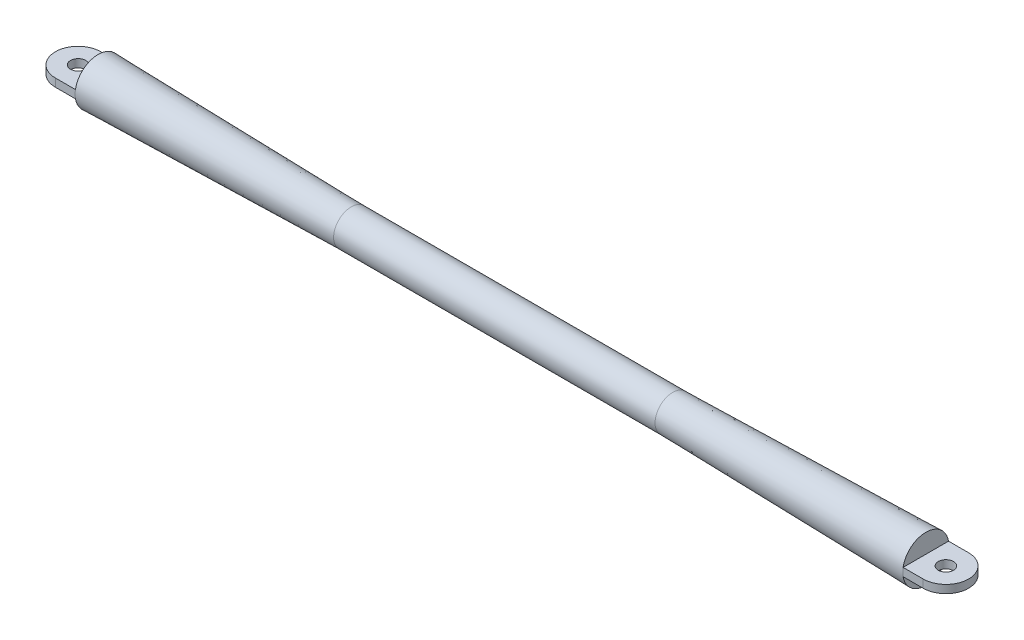
ISO-10303-21;
HEADER;
FILE_DESCRIPTION(('STEP AP214'),'2;1');
FILE_NAME('part.step','',(''),(''),'','','');
FILE_SCHEMA(('AUTOMOTIVE_DESIGN { 1 0 10303 214 1 1 1 1 }'));
ENDSEC;
DATA;
#1=APPLICATION_CONTEXT('core data for automotive mechanical design processes');
#2=APPLICATION_PROTOCOL_DEFINITION('international standard','automotive_design',2000,#1);
#3=PRODUCT_CONTEXT('',#1,'mechanical');
#4=PRODUCT('Part','Part','',(#3));
#5=PRODUCT_RELATED_PRODUCT_CATEGORY('part','',(#4));
#6=PRODUCT_DEFINITION_FORMATION('','',#4);
#7=PRODUCT_DEFINITION_CONTEXT('part definition',#1,'design');
#8=PRODUCT_DEFINITION('design','',#6,#7);
#9=PRODUCT_DEFINITION_SHAPE('','',#8);
#10=(LENGTH_UNIT() NAMED_UNIT(*) SI_UNIT(.MILLI.,.METRE.));
#11=(NAMED_UNIT(*) PLANE_ANGLE_UNIT() SI_UNIT($,.RADIAN.));
#12=(NAMED_UNIT(*) SI_UNIT($,.STERADIAN.) SOLID_ANGLE_UNIT());
#13=UNCERTAINTY_MEASURE_WITH_UNIT(LENGTH_MEASURE(1.E-05),#10,'distance_accuracy_value','');
#14=(GEOMETRIC_REPRESENTATION_CONTEXT(3) GLOBAL_UNCERTAINTY_ASSIGNED_CONTEXT((#13)) GLOBAL_UNIT_ASSIGNED_CONTEXT((#10,
#11,#12)) REPRESENTATION_CONTEXT('',''));
#15=CARTESIAN_POINT('',(0.,0.,0.));
#16=DIRECTION('',(0.,0.,1.));
#17=DIRECTION('',(1.,0.,0.));
#18=AXIS2_PLACEMENT_3D('',#15,#16,#17);
#19=CARTESIAN_POINT('',(-515.,5.,-750.));
#20=DIRECTION('',(0.,1.,0.));
#21=DIRECTION('',(0.,0.,1.));
#22=AXIS2_PLACEMENT_3D('',#19,#20,#21);
#23=PLANE('',#22);
#24=DIRECTION('',(0.,0.,1.));
#25=VECTOR('',#24,1.);
#26=CARTESIAN_POINT('',(-515.,5.,-750.));
#27=LINE('',#26,#25);
#28=CARTESIAN_POINT('',(-515.,5.,-28.2814143917874));
#29=VERTEX_POINT('',#28);
#30=CARTESIAN_POINT('',(-515.,5.,28.2814143917874));
#31=VERTEX_POINT('',#30);
#32=EDGE_CURVE('E132',#29,#31,#27,.T.);
#33=ORIENTED_EDGE('',*,*,#32,.F.);
#34=DIRECTION('',(-1.,0.,0.));
#35=VECTOR('',#34,1.);
#36=CARTESIAN_POINT('',(-515.,5.,-28.2814143917874));
#37=LINE('',#36,#35);
#38=CARTESIAN_POINT('',(-540.,5.,-28.2814143917874));
#39=VERTEX_POINT('',#38);
#40=EDGE_CURVE('E121',#29,#39,#37,.T.);
#41=ORIENTED_EDGE('',*,*,#40,.T.);
#42=CARTESIAN_POINT('',(-540.,5.,0.));
#43=DIRECTION('',(0.,1.,0.));
#44=DIRECTION('',(0.,0.,1.));
#45=AXIS2_PLACEMENT_3D('',#42,#43,#44);
#46=CIRCLE('',#45,28.2814143917874);
#47=CARTESIAN_POINT('',(-540.,5.,28.2814143917874));
#48=VERTEX_POINT('',#47);
#49=EDGE_CURVE('E120',#39,#48,#46,.T.);
#50=ORIENTED_EDGE('',*,*,#49,.T.);
#51=DIRECTION('',(1.,0.,0.));
#52=VECTOR('',#51,1.);
#53=CARTESIAN_POINT('',(-515.,5.,28.2814143917874));
#54=LINE('',#53,#52);
#55=EDGE_CURVE('E104',#48,#31,#54,.T.);
#56=ORIENTED_EDGE('',*,*,#55,.T.);
#57=EDGE_LOOP('',(#33,#41,#50,#56));
#58=FACE_BOUND('',#57,.T.);
#59=CARTESIAN_POINT('',(-540.,5.,0.));
#60=DIRECTION('',(0.,-1.,0.));
#61=DIRECTION('',(0.,0.,1.));
#62=AXIS2_PLACEMENT_3D('',#59,#60,#61);
#63=CIRCLE('',#62,9.49999999999995);
#64=CARTESIAN_POINT('',(-540.,5.,9.49999999999994));
#65=VERTEX_POINT('',#64);
#66=EDGE_CURVE('E215',#65,#65,#63,.T.);
#67=ORIENTED_EDGE('',*,*,#66,.T.);
#68=EDGE_LOOP('',(#67));
#69=FACE_BOUND('',#68,.T.);
#70=ADVANCED_FACE('F32',(#58,#69),#23,.T.);
#71=CARTESIAN_POINT('',(-515.,-5.,-750.));
#72=DIRECTION('',(0.,-1.,0.));
#73=DIRECTION('',(0.,0.,-1.));
#74=AXIS2_PLACEMENT_3D('',#71,#72,#73);
#75=PLANE('',#74);
#76=CARTESIAN_POINT('',(-540.,-5.,0.));
#77=DIRECTION('',(0.,-1.,0.));
#78=DIRECTION('',(0.,0.,-1.));
#79=AXIS2_PLACEMENT_3D('',#76,#77,#78);
#80=CIRCLE('',#79,28.2814143917874);
#81=CARTESIAN_POINT('',(-540.,-5.,28.2814143917874));
#82=VERTEX_POINT('',#81);
#83=CARTESIAN_POINT('',(-540.,-5.,-28.2814143917874));
#84=VERTEX_POINT('',#83);
#85=EDGE_CURVE('E11',#82,#84,#80,.T.);
#86=ORIENTED_EDGE('',*,*,#85,.T.);
#87=DIRECTION('',(1.,0.,0.));
#88=VECTOR('',#87,1.);
#89=CARTESIAN_POINT('',(-515.,-5.,-28.2814143917874));
#90=LINE('',#89,#88);
#91=CARTESIAN_POINT('',(-515.,-5.,-28.2814143917874));
#92=VERTEX_POINT('',#91);
#93=EDGE_CURVE('E131',#84,#92,#90,.T.);
#94=ORIENTED_EDGE('',*,*,#93,.T.);
#95=DIRECTION('',(0.,0.,1.));
#96=VECTOR('',#95,1.);
#97=CARTESIAN_POINT('',(-515.,-5.,-750.));
#98=LINE('',#97,#96);
#99=CARTESIAN_POINT('',(-515.,-5.,28.2814143917874));
#100=VERTEX_POINT('',#99);
#101=EDGE_CURVE('E126',#92,#100,#98,.T.);
#102=ORIENTED_EDGE('',*,*,#101,.T.);
#103=DIRECTION('',(-1.,0.,0.));
#104=VECTOR('',#103,1.);
#105=CARTESIAN_POINT('',(-515.,-5.,28.2814143917874));
#106=LINE('',#105,#104);
#107=EDGE_CURVE('E97',#100,#82,#106,.T.);
#108=ORIENTED_EDGE('',*,*,#107,.T.);
#109=EDGE_LOOP('',(#86,#94,#102,#108));
#110=FACE_BOUND('',#109,.T.);
#111=CARTESIAN_POINT('',(-540.,-5.,0.));
#112=DIRECTION('',(0.,-1.,0.));
#113=DIRECTION('',(0.,0.,-1.));
#114=AXIS2_PLACEMENT_3D('',#111,#112,#113);
#115=CIRCLE('',#114,9.49999999999995);
#116=CARTESIAN_POINT('',(-540.,-5.,-9.49999999999996));
#117=VERTEX_POINT('',#116);
#118=EDGE_CURVE('E36',#117,#117,#115,.F.);
#119=ORIENTED_EDGE('',*,*,#118,.T.);
#120=EDGE_LOOP('',(#119));
#121=FACE_BOUND('',#120,.T.);
#122=ADVANCED_FACE('F129',(#110,#121),#75,.T.);
#123=CARTESIAN_POINT('',(-575.,0.,0.));
#124=DIRECTION('',(-1.,0.,0.));
#125=DIRECTION('',(0.,0.,-1.));
#126=AXIS2_PLACEMENT_3D('',#123,#124,#125);
#127=CONICAL_SURFACE('',#126,30.,0.0213300978711052);
#128=CARTESIAN_POINT('',(-200.,0.,0.));
#129=DIRECTION('',(-1.,0.,0.));
#130=DIRECTION('',(0.,0.,1.));
#131=AXIS2_PLACEMENT_3D('',#128,#129,#130);
#132=CIRCLE('',#131,22.);
#133=CARTESIAN_POINT('',(-200.,0.,22.));
#134=VERTEX_POINT('',#133);
#135=EDGE_CURVE('E136',#134,#134,#132,.T.);
#136=ORIENTED_EDGE('',*,*,#135,.T.);
#137=EDGE_LOOP('',(#136));
#138=FACE_BOUND('',#137,.T.);
#139=CARTESIAN_POINT('',(-515.,0.,0.));
#140=DIRECTION('',(-1.,0.,0.));
#141=DIRECTION('',(0.,0.,1.));
#142=AXIS2_PLACEMENT_3D('',#139,#140,#141);
#143=CIRCLE('',#142,28.72);
#144=EDGE_CURVE('E133',#29,#92,#143,.T.);
#145=ORIENTED_EDGE('',*,*,#144,.F.);
#146=CARTESIAN_POINT('',(-515.,0.,0.));
#147=DIRECTION('',(-1.,0.,0.));
#148=DIRECTION('',(0.,0.,1.));
#149=AXIS2_PLACEMENT_3D('',#146,#147,#148);
#150=CIRCLE('',#149,28.72);
#151=EDGE_CURVE('E119',#31,#29,#150,.T.);
#152=ORIENTED_EDGE('',*,*,#151,.F.);
#153=CARTESIAN_POINT('',(-515.,0.,0.));
#154=DIRECTION('',(-1.,0.,0.));
#155=DIRECTION('',(0.,0.,1.));
#156=AXIS2_PLACEMENT_3D('',#153,#154,#155);
#157=CIRCLE('',#156,28.72);
#158=EDGE_CURVE('E110',#100,#31,#157,.T.);
#159=ORIENTED_EDGE('',*,*,#158,.F.);
#160=CARTESIAN_POINT('',(-515.,0.,0.));
#161=DIRECTION('',(-1.,0.,0.));
#162=DIRECTION('',(0.,0.,1.));
#163=AXIS2_PLACEMENT_3D('',#160,#161,#162);
#164=CIRCLE('',#163,28.72);
#165=EDGE_CURVE('E41',#92,#100,#164,.T.);
#166=ORIENTED_EDGE('',*,*,#165,.F.);
#167=EDGE_LOOP('',(#145,#152,#159,#166));
#168=FACE_BOUND('',#167,.T.);
#169=ADVANCED_FACE('F117',(#138,#168),#127,.T.);
#170=CARTESIAN_POINT('',(575.,0.,0.));
#171=DIRECTION('',(1.,0.,0.));
#172=DIRECTION('',(0.,0.,-1.));
#173=AXIS2_PLACEMENT_3D('',#170,#171,#172);
#174=CONICAL_SURFACE('',#173,30.,0.0213300978711052);
#175=CARTESIAN_POINT('',(200.,0.,0.));
#176=DIRECTION('',(-1.,0.,0.));
#177=DIRECTION('',(0.,0.,1.));
#178=AXIS2_PLACEMENT_3D('',#175,#176,#177);
#179=CIRCLE('',#178,22.);
#180=CARTESIAN_POINT('',(200.,0.,22.));
#181=VERTEX_POINT('',#180);
#182=EDGE_CURVE('E178',#181,#181,#179,.T.);
#183=ORIENTED_EDGE('',*,*,#182,.F.);
#184=EDGE_LOOP('',(#183));
#185=FACE_BOUND('',#184,.T.);
#186=CARTESIAN_POINT('',(515.,0.,0.));
#187=DIRECTION('',(-1.,0.,0.));
#188=DIRECTION('',(0.,0.,1.));
#189=AXIS2_PLACEMENT_3D('',#186,#187,#188);
#190=CIRCLE('',#189,28.72);
#191=CARTESIAN_POINT('',(515.,5.,28.2814143917874));
#192=VERTEX_POINT('',#191);
#193=CARTESIAN_POINT('',(515.,5.,-28.2814143917874));
#194=VERTEX_POINT('',#193);
#195=EDGE_CURVE('E181',#192,#194,#190,.T.);
#196=ORIENTED_EDGE('',*,*,#195,.T.);
#197=CARTESIAN_POINT('',(515.,0.,0.));
#198=DIRECTION('',(-1.,0.,0.));
#199=DIRECTION('',(0.,0.,1.));
#200=AXIS2_PLACEMENT_3D('',#197,#198,#199);
#201=CIRCLE('',#200,28.72);
#202=CARTESIAN_POINT('',(515.,-5.,-28.2814143917874));
#203=VERTEX_POINT('',#202);
#204=EDGE_CURVE('E169',#194,#203,#201,.T.);
#205=ORIENTED_EDGE('',*,*,#204,.T.);
#206=CARTESIAN_POINT('',(515.,0.,0.));
#207=DIRECTION('',(-1.,0.,0.));
#208=DIRECTION('',(0.,0.,1.));
#209=AXIS2_PLACEMENT_3D('',#206,#207,#208);
#210=CIRCLE('',#209,28.72);
#211=CARTESIAN_POINT('',(515.,-5.,28.2814143917874));
#212=VERTEX_POINT('',#211);
#213=EDGE_CURVE('E184',#203,#212,#210,.T.);
#214=ORIENTED_EDGE('',*,*,#213,.T.);
#215=CARTESIAN_POINT('',(515.,0.,0.));
#216=DIRECTION('',(-1.,0.,0.));
#217=DIRECTION('',(0.,0.,1.));
#218=AXIS2_PLACEMENT_3D('',#215,#216,#217);
#219=CIRCLE('',#218,28.72);
#220=EDGE_CURVE('E166',#212,#192,#219,.T.);
#221=ORIENTED_EDGE('',*,*,#220,.T.);
#222=EDGE_LOOP('',(#196,#205,#214,#221));
#223=FACE_BOUND('',#222,.T.);
#224=ADVANCED_FACE('F34',(#185,#223),#174,.T.);
#225=CARTESIAN_POINT('',(0.,0.,0.));
#226=DIRECTION('',(-1.,0.,0.));
#227=DIRECTION('',(0.,0.,1.));
#228=AXIS2_PLACEMENT_3D('',#225,#226,#227);
#229=CYLINDRICAL_SURFACE('',#228,22.);
#230=ORIENTED_EDGE('',*,*,#182,.T.);
#231=EDGE_LOOP('',(#230));
#232=FACE_BOUND('',#231,.T.);
#233=ORIENTED_EDGE('',*,*,#135,.F.);
#234=EDGE_LOOP('',(#233));
#235=FACE_BOUND('',#234,.T.);
#236=ADVANCED_FACE('F281',(#232,#235),#229,.T.);
#237=CARTESIAN_POINT('',(515.,60.9405664196084,-750.));
#238=DIRECTION('',(-1.,0.,0.));
#239=DIRECTION('',(0.,0.,1.));
#240=AXIS2_PLACEMENT_3D('',#237,#238,#239);
#241=PLANE('',#240);
#242=DIRECTION('',(0.,0.,1.));
#243=VECTOR('',#242,1.);
#244=CARTESIAN_POINT('',(515.,5.,-750.));
#245=LINE('',#244,#243);
#246=EDGE_CURVE('E175',#194,#192,#245,.T.);
#247=ORIENTED_EDGE('',*,*,#246,.F.);
#248=ORIENTED_EDGE('',*,*,#195,.F.);
#249=EDGE_LOOP('',(#247,#248));
#250=FACE_BOUND('',#249,.T.);
#251=ADVANCED_FACE('F278',(#250),#241,.F.);
#252=CARTESIAN_POINT('',(515.,5.,-750.));
#253=DIRECTION('',(0.,-1.,0.));
#254=DIRECTION('',(0.,0.,-1.));
#255=AXIS2_PLACEMENT_3D('',#252,#253,#254);
#256=PLANE('',#255);
#257=CARTESIAN_POINT('',(540.,5.,0.));
#258=DIRECTION('',(0.,1.,0.));
#259=DIRECTION('',(0.,0.,1.));
#260=AXIS2_PLACEMENT_3D('',#257,#258,#259);
#261=CIRCLE('',#260,9.49999999999995);
#262=CARTESIAN_POINT('',(540.,5.,9.49999999999994));
#263=VERTEX_POINT('',#262);
#264=EDGE_CURVE('E143',#263,#263,#261,.T.);
#265=ORIENTED_EDGE('',*,*,#264,.F.);
#266=EDGE_LOOP('',(#265));
#267=FACE_BOUND('',#266,.T.);
#268=ORIENTED_EDGE('',*,*,#246,.T.);
#269=DIRECTION('',(1.,0.,0.));
#270=VECTOR('',#269,1.);
#271=CARTESIAN_POINT('',(515.,5.,28.2814143917874));
#272=LINE('',#271,#270);
#273=CARTESIAN_POINT('',(540.,5.,28.2814143917874));
#274=VERTEX_POINT('',#273);
#275=EDGE_CURVE('E163',#192,#274,#272,.T.);
#276=ORIENTED_EDGE('',*,*,#275,.T.);
#277=CARTESIAN_POINT('',(540.,5.,0.));
#278=DIRECTION('',(0.,-1.,0.));
#279=DIRECTION('',(0.,0.,-1.));
#280=AXIS2_PLACEMENT_3D('',#277,#278,#279);
#281=CIRCLE('',#280,28.2814143917874);
#282=CARTESIAN_POINT('',(540.,5.,-28.2814143917874));
#283=VERTEX_POINT('',#282);
#284=EDGE_CURVE('E160',#274,#283,#281,.F.);
#285=ORIENTED_EDGE('',*,*,#284,.T.);
#286=DIRECTION('',(-1.,0.,0.));
#287=VECTOR('',#286,1.);
#288=CARTESIAN_POINT('',(515.,5.,-28.2814143917874));
#289=LINE('',#288,#287);
#290=EDGE_CURVE('E150',#283,#194,#289,.T.);
#291=ORIENTED_EDGE('',*,*,#290,.T.);
#292=EDGE_LOOP('',(#268,#276,#285,#291));
#293=FACE_BOUND('',#292,.T.);
#294=ADVANCED_FACE('F271',(#267,#293),#256,.F.);
#295=CARTESIAN_POINT('',(515.,-60.9405664196084,-750.));
#296=DIRECTION('',(-1.,0.,0.));
#297=DIRECTION('',(0.,0.,1.));
#298=AXIS2_PLACEMENT_3D('',#295,#296,#297);
#299=PLANE('',#298);
#300=DIRECTION('',(0.,0.,1.));
#301=VECTOR('',#300,1.);
#302=CARTESIAN_POINT('',(515.,-5.,-750.));
#303=LINE('',#302,#301);
#304=EDGE_CURVE('E172',#203,#212,#303,.T.);
#305=ORIENTED_EDGE('',*,*,#304,.T.);
#306=ORIENTED_EDGE('',*,*,#213,.F.);
#307=EDGE_LOOP('',(#305,#306));
#308=FACE_BOUND('',#307,.T.);
#309=ADVANCED_FACE('F268',(#308),#299,.F.);
#310=CARTESIAN_POINT('',(515.,-5.,-750.));
#311=DIRECTION('',(0.,1.,0.));
#312=DIRECTION('',(0.,0.,1.));
#313=AXIS2_PLACEMENT_3D('',#310,#311,#312);
#314=PLANE('',#313);
#315=CARTESIAN_POINT('',(540.,-5.,0.));
#316=DIRECTION('',(0.,1.,0.));
#317=DIRECTION('',(0.,0.,1.));
#318=AXIS2_PLACEMENT_3D('',#315,#316,#317);
#319=CIRCLE('',#318,9.49999999999995);
#320=CARTESIAN_POINT('',(540.,-5.,9.49999999999994));
#321=VERTEX_POINT('',#320);
#322=EDGE_CURVE('E146',#321,#321,#319,.T.);
#323=ORIENTED_EDGE('',*,*,#322,.T.);
#324=EDGE_LOOP('',(#323));
#325=FACE_BOUND('',#324,.T.);
#326=CARTESIAN_POINT('',(540.,-5.,0.));
#327=DIRECTION('',(0.,1.,0.));
#328=DIRECTION('',(0.,0.,1.));
#329=AXIS2_PLACEMENT_3D('',#326,#327,#328);
#330=CIRCLE('',#329,28.2814143917874);
#331=CARTESIAN_POINT('',(540.,-5.,-28.2814143917874));
#332=VERTEX_POINT('',#331);
#333=CARTESIAN_POINT('',(540.,-5.,28.2814143917874));
#334=VERTEX_POINT('',#333);
#335=EDGE_CURVE('E190',#332,#334,#330,.F.);
#336=ORIENTED_EDGE('',*,*,#335,.T.);
#337=DIRECTION('',(-1.,0.,0.));
#338=VECTOR('',#337,1.);
#339=CARTESIAN_POINT('',(515.,-5.,28.2814143917874));
#340=LINE('',#339,#338);
#341=EDGE_CURVE('E193',#334,#212,#340,.T.);
#342=ORIENTED_EDGE('',*,*,#341,.T.);
#343=ORIENTED_EDGE('',*,*,#304,.F.);
#344=DIRECTION('',(1.,0.,0.));
#345=VECTOR('',#344,1.);
#346=CARTESIAN_POINT('',(515.,-5.,-28.2814143917874));
#347=LINE('',#346,#345);
#348=EDGE_CURVE('E187',#203,#332,#347,.T.);
#349=ORIENTED_EDGE('',*,*,#348,.T.);
#350=EDGE_LOOP('',(#336,#342,#343,#349));
#351=FACE_BOUND('',#350,.T.);
#352=ADVANCED_FACE('F266',(#325,#351),#314,.F.);
#353=CARTESIAN_POINT('',(515.,-745.,-28.2814143917874));
#354=DIRECTION('',(-1.,0.,0.));
#355=DIRECTION('',(0.,0.,1.));
#356=AXIS2_PLACEMENT_3D('',#353,#354,#355);
#357=PLANE('',#356);
#358=DIRECTION('',(0.,1.,0.));
#359=VECTOR('',#358,1.);
#360=CARTESIAN_POINT('',(515.,-745.,-28.2814143917874));
#361=LINE('',#360,#359);
#362=EDGE_CURVE('E155',#203,#194,#361,.T.);
#363=ORIENTED_EDGE('',*,*,#362,.F.);
#364=ORIENTED_EDGE('',*,*,#204,.F.);
#365=EDGE_LOOP('',(#363,#364));
#366=FACE_BOUND('',#365,.T.);
#367=ADVANCED_FACE('F253',(#366),#357,.F.);
#368=CARTESIAN_POINT('',(515.,-745.,67.5975669280569));
#369=DIRECTION('',(-1.,0.,0.));
#370=DIRECTION('',(0.,0.,1.));
#371=AXIS2_PLACEMENT_3D('',#368,#369,#370);
#372=PLANE('',#371);
#373=DIRECTION('',(0.,1.,0.));
#374=VECTOR('',#373,1.);
#375=CARTESIAN_POINT('',(515.,-745.,28.2814143917874));
#376=LINE('',#375,#374);
#377=EDGE_CURVE('E147',#212,#192,#376,.T.);
#378=ORIENTED_EDGE('',*,*,#377,.T.);
#379=ORIENTED_EDGE('',*,*,#220,.F.);
#380=EDGE_LOOP('',(#378,#379));
#381=FACE_BOUND('',#380,.T.);
#382=ADVANCED_FACE('F249',(#381),#372,.F.);
#383=CARTESIAN_POINT('',(540.,-745.,28.2814143917874));
#384=DIRECTION('',(0.,0.,-1.));
#385=DIRECTION('',(-1.,0.,0.));
#386=AXIS2_PLACEMENT_3D('',#383,#384,#385);
#387=PLANE('',#386);
#388=ORIENTED_EDGE('',*,*,#377,.F.);
#389=ORIENTED_EDGE('',*,*,#341,.F.);
#390=DIRECTION('',(0.,1.,0.));
#391=VECTOR('',#390,1.);
#392=CARTESIAN_POINT('',(540.,-745.,28.2814143917874));
#393=LINE('',#392,#391);
#394=EDGE_CURVE('E151',#334,#274,#393,.T.);
#395=ORIENTED_EDGE('',*,*,#394,.T.);
#396=ORIENTED_EDGE('',*,*,#275,.F.);
#397=EDGE_LOOP('',(#388,#389,#395,#396));
#398=FACE_BOUND('',#397,.T.);
#399=ADVANCED_FACE('F252',(#398),#387,.F.);
#400=CARTESIAN_POINT('',(540.,-745.,0.));
#401=DIRECTION('',(0.,1.,0.));
#402=DIRECTION('',(0.,0.,1.));
#403=AXIS2_PLACEMENT_3D('',#400,#401,#402);
#404=CYLINDRICAL_SURFACE('',#403,28.2814143917874);
#405=ORIENTED_EDGE('',*,*,#394,.F.);
#406=ORIENTED_EDGE('',*,*,#335,.F.);
#407=DIRECTION('',(0.,1.,0.));
#408=VECTOR('',#407,1.);
#409=CARTESIAN_POINT('',(540.,-745.,-28.2814143917874));
#410=LINE('',#409,#408);
#411=EDGE_CURVE('E56',#332,#283,#410,.T.);
#412=ORIENTED_EDGE('',*,*,#411,.T.);
#413=ORIENTED_EDGE('',*,*,#284,.F.);
#414=EDGE_LOOP('',(#405,#406,#412,#413));
#415=FACE_BOUND('',#414,.T.);
#416=ADVANCED_FACE('F257',(#415),#404,.T.);
#417=CARTESIAN_POINT('',(515.,-745.,-28.2814143917874));
#418=DIRECTION('',(0.,0.,1.));
#419=DIRECTION('',(1.,0.,0.));
#420=AXIS2_PLACEMENT_3D('',#417,#418,#419);
#421=PLANE('',#420);
#422=ORIENTED_EDGE('',*,*,#411,.F.);
#423=ORIENTED_EDGE('',*,*,#348,.F.);
#424=ORIENTED_EDGE('',*,*,#362,.T.);
#425=ORIENTED_EDGE('',*,*,#290,.F.);
#426=EDGE_LOOP('',(#422,#423,#424,#425));
#427=FACE_BOUND('',#426,.T.);
#428=ADVANCED_FACE('F247',(#427),#421,.F.);
#429=CARTESIAN_POINT('',(540.,-28.72,0.));
#430=DIRECTION('',(0.,1.,0.));
#431=DIRECTION('',(0.,0.,1.));
#432=AXIS2_PLACEMENT_3D('',#429,#430,#431);
#433=CYLINDRICAL_SURFACE('',#432,9.49999999999995);
#434=ORIENTED_EDGE('',*,*,#264,.T.);
#435=EDGE_LOOP('',(#434));
#436=FACE_BOUND('',#435,.T.);
#437=ORIENTED_EDGE('',*,*,#322,.F.);
#438=EDGE_LOOP('',(#437));
#439=FACE_BOUND('',#438,.T.);
#440=ADVANCED_FACE('F241',(#436,#439),#433,.F.);
#441=CARTESIAN_POINT('',(-515.,60.9405664196084,-750.));
#442=DIRECTION('',(-1.,0.,0.));
#443=DIRECTION('',(0.,0.,1.));
#444=AXIS2_PLACEMENT_3D('',#441,#442,#443);
#445=PLANE('',#444);
#446=ORIENTED_EDGE('',*,*,#151,.T.);
#447=ORIENTED_EDGE('',*,*,#32,.T.);
#448=EDGE_LOOP('',(#446,#447));
#449=FACE_BOUND('',#448,.T.);
#450=ADVANCED_FACE('F200',(#449),#445,.T.);
#451=CARTESIAN_POINT('',(-515.,-60.9405664196084,-750.));
#452=DIRECTION('',(-1.,0.,0.));
#453=DIRECTION('',(0.,0.,1.));
#454=AXIS2_PLACEMENT_3D('',#451,#452,#453);
#455=PLANE('',#454);
#456=ORIENTED_EDGE('',*,*,#165,.T.);
#457=ORIENTED_EDGE('',*,*,#101,.F.);
#458=EDGE_LOOP('',(#456,#457));
#459=FACE_BOUND('',#458,.T.);
#460=ADVANCED_FACE('F125',(#459),#455,.T.);
#461=CARTESIAN_POINT('',(-515.,-745.,-28.2814143917874));
#462=DIRECTION('',(-1.,0.,0.));
#463=DIRECTION('',(0.,0.,1.));
#464=AXIS2_PLACEMENT_3D('',#461,#462,#463);
#465=PLANE('',#464);
#466=ORIENTED_EDGE('',*,*,#144,.T.);
#467=DIRECTION('',(0.,1.,0.));
#468=VECTOR('',#467,1.);
#469=CARTESIAN_POINT('',(-515.,-745.,-28.2814143917874));
#470=LINE('',#469,#468);
#471=EDGE_CURVE('E105',#92,#29,#470,.T.);
#472=ORIENTED_EDGE('',*,*,#471,.T.);
#473=EDGE_LOOP('',(#466,#472));
#474=FACE_BOUND('',#473,.T.);
#475=ADVANCED_FACE('F401',(#474),#465,.T.);
#476=CARTESIAN_POINT('',(-515.,-745.,67.5975669280569));
#477=DIRECTION('',(-1.,0.,0.));
#478=DIRECTION('',(0.,0.,1.));
#479=AXIS2_PLACEMENT_3D('',#476,#477,#478);
#480=PLANE('',#479);
#481=ORIENTED_EDGE('',*,*,#158,.T.);
#482=DIRECTION('',(0.,1.,0.));
#483=VECTOR('',#482,1.);
#484=CARTESIAN_POINT('',(-515.,-745.,28.2814143917874));
#485=LINE('',#484,#483);
#486=EDGE_CURVE('E100',#100,#31,#485,.T.);
#487=ORIENTED_EDGE('',*,*,#486,.F.);
#488=EDGE_LOOP('',(#481,#487));
#489=FACE_BOUND('',#488,.T.);
#490=ADVANCED_FACE('F109',(#489),#480,.T.);
#491=CARTESIAN_POINT('',(-515.,-745.,-28.2814143917874));
#492=DIRECTION('',(0.,0.,-1.));
#493=DIRECTION('',(-1.,0.,0.));
#494=AXIS2_PLACEMENT_3D('',#491,#492,#493);
#495=PLANE('',#494);
#496=ORIENTED_EDGE('',*,*,#471,.F.);
#497=ORIENTED_EDGE('',*,*,#93,.F.);
#498=DIRECTION('',(0.,1.,0.));
#499=VECTOR('',#498,1.);
#500=CARTESIAN_POINT('',(-540.,-745.,-28.2814143917874));
#501=LINE('',#500,#499);
#502=EDGE_CURVE('E210',#84,#39,#501,.T.);
#503=ORIENTED_EDGE('',*,*,#502,.T.);
#504=ORIENTED_EDGE('',*,*,#40,.F.);
#505=EDGE_LOOP('',(#496,#497,#503,#504));
#506=FACE_BOUND('',#505,.T.);
#507=ADVANCED_FACE('F419',(#506),#495,.T.);
#508=CARTESIAN_POINT('',(-540.,-745.,0.));
#509=DIRECTION('',(0.,1.,0.));
#510=DIRECTION('',(0.,0.,1.));
#511=AXIS2_PLACEMENT_3D('',#508,#509,#510);
#512=CYLINDRICAL_SURFACE('',#511,28.2814143917874);
#513=ORIENTED_EDGE('',*,*,#502,.F.);
#514=ORIENTED_EDGE('',*,*,#85,.F.);
#515=DIRECTION('',(0.,1.,0.));
#516=VECTOR('',#515,1.);
#517=CARTESIAN_POINT('',(-540.,-745.,28.2814143917874));
#518=LINE('',#517,#516);
#519=EDGE_CURVE('E48',#82,#48,#518,.T.);
#520=ORIENTED_EDGE('',*,*,#519,.T.);
#521=ORIENTED_EDGE('',*,*,#49,.F.);
#522=EDGE_LOOP('',(#513,#514,#520,#521));
#523=FACE_BOUND('',#522,.T.);
#524=ADVANCED_FACE('F228',(#523),#512,.T.);
#525=CARTESIAN_POINT('',(-540.,-745.,28.2814143917874));
#526=DIRECTION('',(0.,0.,1.));
#527=DIRECTION('',(1.,0.,0.));
#528=AXIS2_PLACEMENT_3D('',#525,#526,#527);
#529=PLANE('',#528);
#530=ORIENTED_EDGE('',*,*,#519,.F.);
#531=ORIENTED_EDGE('',*,*,#107,.F.);
#532=ORIENTED_EDGE('',*,*,#486,.T.);
#533=ORIENTED_EDGE('',*,*,#55,.F.);
#534=EDGE_LOOP('',(#530,#531,#532,#533));
#535=FACE_BOUND('',#534,.T.);
#536=ADVANCED_FACE('F99',(#535),#529,.T.);
#537=CARTESIAN_POINT('',(-540.,-28.72,0.));
#538=DIRECTION('',(0.,1.,0.));
#539=DIRECTION('',(0.,0.,1.));
#540=AXIS2_PLACEMENT_3D('',#537,#538,#539);
#541=CYLINDRICAL_SURFACE('',#540,9.49999999999995);
#542=ORIENTED_EDGE('',*,*,#118,.F.);
#543=EDGE_LOOP('',(#542));
#544=FACE_BOUND('',#543,.T.);
#545=ORIENTED_EDGE('',*,*,#66,.F.);
#546=EDGE_LOOP('',(#545));
#547=FACE_BOUND('',#546,.T.);
#548=ADVANCED_FACE('F221',(#544,#547),#541,.F.);
#549=CLOSED_SHELL('',(#70,#122,#169,#224,#236,#251,#294,#309,#352,#367,#382,#399,#416,#428,#440,
#450,#460,#475,#490,#507,#524,#536,#548));
#550=MANIFOLD_SOLID_BREP('B2',#549);
#551=ADVANCED_BREP_SHAPE_REPRESENTATION('',(#18,#550),#14);
#552=SHAPE_DEFINITION_REPRESENTATION(#9,#551);
ENDSEC;
END-ISO-10303-21;
